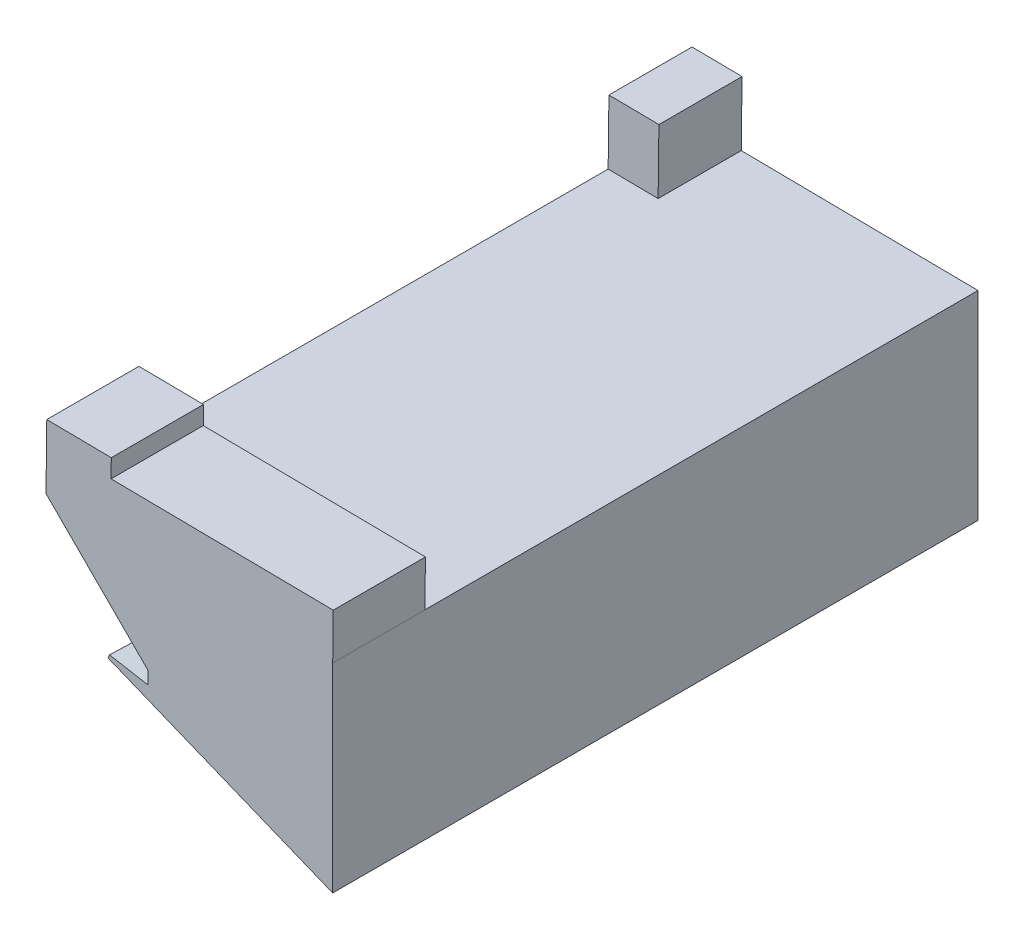
ISO-10303-21;
HEADER;
FILE_DESCRIPTION(('STEP AP214'),'2;1');
FILE_NAME('part.step','',(''),(''),'','','');
FILE_SCHEMA(('AUTOMOTIVE_DESIGN { 1 0 10303 214 1 1 1 1 }'));
ENDSEC;
DATA;
#1=APPLICATION_CONTEXT('core data for automotive mechanical design processes');
#2=APPLICATION_PROTOCOL_DEFINITION('international standard','automotive_design',2000,#1);
#3=PRODUCT_CONTEXT('',#1,'mechanical');
#4=PRODUCT('Part','Part','',(#3));
#5=PRODUCT_RELATED_PRODUCT_CATEGORY('part','',(#4));
#6=PRODUCT_DEFINITION_FORMATION('','',#4);
#7=PRODUCT_DEFINITION_CONTEXT('part definition',#1,'design');
#8=PRODUCT_DEFINITION('design','',#6,#7);
#9=PRODUCT_DEFINITION_SHAPE('','',#8);
#10=(LENGTH_UNIT() NAMED_UNIT(*) SI_UNIT(.MILLI.,.METRE.));
#11=(NAMED_UNIT(*) PLANE_ANGLE_UNIT() SI_UNIT($,.RADIAN.));
#12=(NAMED_UNIT(*) SI_UNIT($,.STERADIAN.) SOLID_ANGLE_UNIT());
#13=UNCERTAINTY_MEASURE_WITH_UNIT(LENGTH_MEASURE(1.E-05),#10,'distance_accuracy_value','');
#14=(GEOMETRIC_REPRESENTATION_CONTEXT(3) GLOBAL_UNCERTAINTY_ASSIGNED_CONTEXT((#13)) GLOBAL_UNIT_ASSIGNED_CONTEXT((#10,
#11,#12)) REPRESENTATION_CONTEXT('',''));
#15=CARTESIAN_POINT('',(0.,0.,0.));
#16=DIRECTION('',(0.,0.,1.));
#17=DIRECTION('',(1.,0.,0.));
#18=AXIS2_PLACEMENT_3D('',#15,#16,#17);
#19=CARTESIAN_POINT('',(-5.53174457392195,4.89355431893157,35.));
#20=DIRECTION('',(-0.0118275881117947,-0.999930051633342,0.));
#21=DIRECTION('',(0.999930051633342,-0.0118275881117947,0.));
#22=AXIS2_PLACEMENT_3D('',#19,#20,#21);
#23=PLANE('',#22);
#24=DIRECTION('',(0.999930051633342,-0.0118275881117946,0.));
#25=VECTOR('',#24,1.);
#26=CARTESIAN_POINT('',(-5.53174457392195,4.89355431893157,4.5099339324679));
#27=LINE('',#26,#25);
#28=CARTESIAN_POINT('',(-5.53174457392195,4.89355431893157,4.5099339324679));
#29=VERTEX_POINT('',#28);
#30=CARTESIAN_POINT('',(-2.82079087680111,4.8614880322275,4.5099339324679));
#31=VERTEX_POINT('',#30);
#32=EDGE_CURVE('E254',#29,#31,#27,.T.);
#33=ORIENTED_EDGE('',*,*,#32,.F.);
#34=DIRECTION('',(0.,0.,-1.));
#35=VECTOR('',#34,1.);
#36=CARTESIAN_POINT('',(-5.53174457392195,4.89355431893157,35.));
#37=LINE('',#36,#35);
#38=CARTESIAN_POINT('',(-5.53174457392195,4.89355431893157,30.));
#39=VERTEX_POINT('',#38);
#40=EDGE_CURVE('E175',#39,#29,#37,.T.);
#41=ORIENTED_EDGE('',*,*,#40,.F.);
#42=DIRECTION('',(-0.999930051633342,0.0118275881117947,0.));
#43=VECTOR('',#42,1.);
#44=CARTESIAN_POINT('',(10.0185837776015,4.70961857418167,30.));
#45=LINE('',#44,#43);
#46=CARTESIAN_POINT('',(10.0185837776015,4.70961857418167,30.));
#47=VERTEX_POINT('',#46);
#48=EDGE_CURVE('E215',#47,#39,#45,.T.);
#49=ORIENTED_EDGE('',*,*,#48,.F.);
#50=DIRECTION('',(0.,0.,-1.));
#51=VECTOR('',#50,1.);
#52=CARTESIAN_POINT('',(10.0185837776015,4.70961857418167,35.));
#53=LINE('',#52,#51);
#54=CARTESIAN_POINT('',(10.0185837776015,4.70961857418167,0.));
#55=VERTEX_POINT('',#54);
#56=EDGE_CURVE('E172',#47,#55,#53,.T.);
#57=ORIENTED_EDGE('',*,*,#56,.T.);
#58=DIRECTION('',(-0.999930051633342,0.0118275881117947,0.));
#59=VECTOR('',#58,1.);
#60=CARTESIAN_POINT('',(-5.53174457392195,4.89355431893157,0.));
#61=LINE('',#60,#59);
#62=CARTESIAN_POINT('',(-2.82079087680111,4.8614880322275,0.));
#63=VERTEX_POINT('',#62);
#64=EDGE_CURVE('E183',#55,#63,#61,.T.);
#65=ORIENTED_EDGE('',*,*,#64,.T.);
#66=DIRECTION('',(0.,0.,-1.));
#67=VECTOR('',#66,1.);
#68=CARTESIAN_POINT('',(-2.82079087680111,4.8614880322275,0.));
#69=LINE('',#68,#67);
#70=EDGE_CURVE('E250',#31,#63,#69,.T.);
#71=ORIENTED_EDGE('',*,*,#70,.F.);
#72=EDGE_LOOP('',(#33,#41,#49,#57,#65,#71));
#73=FACE_BOUND('',#72,.T.);
#74=ADVANCED_FACE('F33',(#73),#23,.F.);
#75=CARTESIAN_POINT('',(10.0599803359928,8.20937375489837,35.));
#76=DIRECTION('',(-0.999930051633342,0.0118275881117947,0.));
#77=DIRECTION('',(-0.0118275881117947,-0.999930051633342,0.));
#78=AXIS2_PLACEMENT_3D('',#75,#76,#77);
#79=PLANE('',#78);
#80=DIRECTION('',(0.,0.,-1.));
#81=VECTOR('',#80,1.);
#82=CARTESIAN_POINT('',(10.048152747881,7.20944370326504,35.));
#83=LINE('',#82,#81);
#84=CARTESIAN_POINT('',(10.048152747881,7.20944370326504,35.));
#85=VERTEX_POINT('',#84);
#86=CARTESIAN_POINT('',(10.048152747881,7.20944370326504,30.));
#87=VERTEX_POINT('',#86);
#88=EDGE_CURVE('E226',#85,#87,#83,.T.);
#89=ORIENTED_EDGE('',*,*,#88,.F.);
#90=DIRECTION('',(-0.0118275881117947,-0.999930051633342,0.));
#91=VECTOR('',#90,1.);
#92=CARTESIAN_POINT('',(10.0599803359928,8.20937375489837,35.));
#93=LINE('',#92,#91);
#94=CARTESIAN_POINT('',(10.0185837776015,4.70961857418167,35.));
#95=VERTEX_POINT('',#94);
#96=EDGE_CURVE('E196',#85,#95,#93,.T.);
#97=ORIENTED_EDGE('',*,*,#96,.T.);
#98=EDGE_CURVE('E169',#95,#47,#53,.T.);
#99=ORIENTED_EDGE('',*,*,#98,.T.);
#100=DIRECTION('',(-0.0118275881117947,-0.999930051633342,0.));
#101=VECTOR('',#100,1.);
#102=CARTESIAN_POINT('',(10.0599803359928,8.20937375489837,30.));
#103=LINE('',#102,#101);
#104=EDGE_CURVE('E206',#87,#47,#103,.T.);
#105=ORIENTED_EDGE('',*,*,#104,.F.);
#106=EDGE_LOOP('',(#89,#97,#99,#105));
#107=FACE_BOUND('',#106,.T.);
#108=ADVANCED_FACE('F290',(#107),#79,.F.);
#109=CARTESIAN_POINT('',(0.,-1.32681987793948,35.));
#110=DIRECTION('',(1.,0.,0.));
#111=DIRECTION('',(0.,0.,-1.));
#112=AXIS2_PLACEMENT_3D('',#109,#110,#111);
#113=PLANE('',#112);
#114=DIRECTION('',(0.,-1.,0.));
#115=VECTOR('',#114,1.);
#116=CARTESIAN_POINT('',(0.,-1.32681987793948,0.));
#117=LINE('',#116,#115);
#118=CARTESIAN_POINT('',(0.,-0.638190254990373,0.));
#119=VERTEX_POINT('',#118);
#120=CARTESIAN_POINT('',(0.,-1.32681987793948,0.));
#121=VERTEX_POINT('',#120);
#122=EDGE_CURVE('E193',#119,#121,#117,.T.);
#123=ORIENTED_EDGE('',*,*,#122,.T.);
#124=DIRECTION('',(0.,0.,-1.));
#125=VECTOR('',#124,1.);
#126=CARTESIAN_POINT('',(0.,-1.32681987793948,35.));
#127=LINE('',#126,#125);
#128=CARTESIAN_POINT('',(0.,-1.32681987793948,35.));
#129=VERTEX_POINT('',#128);
#130=EDGE_CURVE('E163',#129,#121,#127,.T.);
#131=ORIENTED_EDGE('',*,*,#130,.F.);
#132=DIRECTION('',(0.,-1.,0.));
#133=VECTOR('',#132,1.);
#134=CARTESIAN_POINT('',(0.,-1.32681987793948,35.));
#135=LINE('',#134,#133);
#136=CARTESIAN_POINT('',(0.,-0.638190254990373,35.));
#137=VERTEX_POINT('',#136);
#138=EDGE_CURVE('E182',#137,#129,#135,.T.);
#139=ORIENTED_EDGE('',*,*,#138,.F.);
#140=DIRECTION('',(0.,0.,-1.));
#141=VECTOR('',#140,1.);
#142=CARTESIAN_POINT('',(0.,-0.638190254990373,35.));
#143=LINE('',#142,#141);
#144=EDGE_CURVE('E176',#137,#119,#143,.T.);
#145=ORIENTED_EDGE('',*,*,#144,.T.);
#146=EDGE_LOOP('',(#123,#131,#139,#145));
#147=FACE_BOUND('',#146,.T.);
#148=ADVANCED_FACE('F336',(#147),#113,.F.);
#149=CARTESIAN_POINT('',(0.,-1.32681987793948,35.));
#150=DIRECTION('',(-0.173648177666924,-0.984807753012209,0.));
#151=DIRECTION('',(0.984807753012209,-0.173648177666924,0.));
#152=AXIS2_PLACEMENT_3D('',#149,#150,#151);
#153=PLANE('',#152);
#154=DIRECTION('',(-0.984807753012209,0.173648177666924,0.));
#155=VECTOR('',#154,1.);
#156=CARTESIAN_POINT('',(0.,-1.32681987793948,0.));
#157=LINE('',#156,#155);
#158=CARTESIAN_POINT('',(-1.05341301011606,-1.1410747424267,0.));
#159=VERTEX_POINT('',#158);
#160=EDGE_CURVE('E190',#121,#159,#157,.T.);
#161=ORIENTED_EDGE('',*,*,#160,.T.);
#162=DIRECTION('',(-0.0295463534896359,0.00520981930177231,0.99954983406447));
#163=VECTOR('',#162,1.);
#164=CARTESIAN_POINT('',(-2.0861216477553,-0.958980346400233,34.9364177123017));
#165=LINE('',#164,#163);
#166=CARTESIAN_POINT('',(-2.08800111857705,-0.958648944984903,35.));
#167=VERTEX_POINT('',#166);
#168=EDGE_CURVE('E269',#159,#167,#165,.T.);
#169=ORIENTED_EDGE('',*,*,#168,.T.);
#170=DIRECTION('',(-0.984807753012209,0.173648177666924,0.));
#171=VECTOR('',#170,1.);
#172=CARTESIAN_POINT('',(0.,-1.32681987793948,35.));
#173=LINE('',#172,#171);
#174=EDGE_CURVE('E154',#129,#167,#173,.T.);
#175=ORIENTED_EDGE('',*,*,#174,.F.);
#176=ORIENTED_EDGE('',*,*,#130,.T.);
#177=EDGE_LOOP('',(#161,#169,#175,#176));
#178=FACE_BOUND('',#177,.T.);
#179=ADVANCED_FACE('F339',(#178),#153,.F.);
#180=CARTESIAN_POINT('',(-3.03214208834861,-0.79217141842193,35.));
#181=DIRECTION('',(0.376339425693862,0.926481859870129,0.));
#182=DIRECTION('',(-0.926481859870129,0.376339425693862,0.));
#183=AXIS2_PLACEMENT_3D('',#180,#181,#182);
#184=PLANE('',#183);
#185=DIRECTION('',(0.,0.,-1.));
#186=VECTOR('',#185,1.);
#187=CARTESIAN_POINT('',(-2.1585103097045,-1.14704299884221,35.));
#188=LINE('',#187,#186);
#189=CARTESIAN_POINT('',(-2.1585103097045,-1.14704299884221,35.));
#190=VERTEX_POINT('',#189);
#191=CARTESIAN_POINT('',(-2.1585103097045,-1.14704299884221,34.8100512014243));
#192=VERTEX_POINT('',#191);
#193=EDGE_CURVE('E156',#190,#192,#188,.T.);
#194=ORIENTED_EDGE('',*,*,#193,.T.);
#195=DIRECTION('',(0.0271787175710836,-0.011040068246162,-0.999569624490616));
#196=VECTOR('',#195,1.);
#197=CARTESIAN_POINT('',(-2.16442247023924,-1.14464146331666,35.027486629354));
#198=LINE('',#197,#196);
#199=CARTESIAN_POINT('',(-1.21201040908917,-1.53151380657805,0.));
#200=VERTEX_POINT('',#199);
#201=EDGE_CURVE('E47',#192,#200,#198,.T.);
#202=ORIENTED_EDGE('',*,*,#201,.T.);
#203=DIRECTION('',(0.926481859870129,-0.376339425693862,0.));
#204=VECTOR('',#203,1.);
#205=CARTESIAN_POINT('',(-3.03214208834861,-0.79217141842193,0.));
#206=LINE('',#205,#204);
#207=CARTESIAN_POINT('',(10.0168816568475,-6.09271999345941,0.));
#208=VERTEX_POINT('',#207);
#209=EDGE_CURVE('E188',#200,#208,#206,.T.);
#210=ORIENTED_EDGE('',*,*,#209,.T.);
#211=DIRECTION('',(0.,0.,-1.));
#212=VECTOR('',#211,1.);
#213=CARTESIAN_POINT('',(10.0168816568475,-6.09271999345941,35.));
#214=LINE('',#213,#212);
#215=CARTESIAN_POINT('',(10.0168816568475,-6.09271999345941,35.));
#216=VERTEX_POINT('',#215);
#217=EDGE_CURVE('E166',#216,#208,#214,.T.);
#218=ORIENTED_EDGE('',*,*,#217,.F.);
#219=DIRECTION('',(0.926481859870129,-0.376339425693862,0.));
#220=VECTOR('',#219,1.);
#221=CARTESIAN_POINT('',(-3.03214208834861,-0.79217141842193,35.));
#222=LINE('',#221,#220);
#223=EDGE_CURVE('E201',#190,#216,#222,.T.);
#224=ORIENTED_EDGE('',*,*,#223,.F.);
#225=EDGE_LOOP('',(#194,#202,#210,#218,#224));
#226=FACE_BOUND('',#225,.T.);
#227=ADVANCED_FACE('F273',(#226),#184,.F.);
#228=CARTESIAN_POINT('',(10.0185837776015,4.70961857418167,35.));
#229=DIRECTION('',(-0.999999987585902,0.000157569652363312,0.));
#230=DIRECTION('',(-0.000157569652363312,-0.999999987585902,0.));
#231=AXIS2_PLACEMENT_3D('',#228,#229,#230);
#232=PLANE('',#231);
#233=DIRECTION('',(0.000157569652363312,0.999999987585902,0.));
#234=VECTOR('',#233,1.);
#235=CARTESIAN_POINT('',(10.0185837776015,4.70961857418167,0.));
#236=LINE('',#235,#234);
#237=EDGE_CURVE('E185',#208,#55,#236,.T.);
#238=ORIENTED_EDGE('',*,*,#237,.T.);
#239=ORIENTED_EDGE('',*,*,#56,.F.);
#240=ORIENTED_EDGE('',*,*,#98,.F.);
#241=DIRECTION('',(0.000157569652363312,0.999999987585902,0.));
#242=VECTOR('',#241,1.);
#243=CARTESIAN_POINT('',(10.0185837776015,4.70961857418167,35.));
#244=LINE('',#243,#242);
#245=EDGE_CURVE('E198',#216,#95,#244,.T.);
#246=ORIENTED_EDGE('',*,*,#245,.F.);
#247=ORIENTED_EDGE('',*,*,#217,.T.);
#248=EDGE_LOOP('',(#238,#239,#240,#246,#247));
#249=FACE_BOUND('',#248,.T.);
#250=ADVANCED_FACE('F282',(#249),#232,.F.);
#251=CARTESIAN_POINT('',(0.,-0.638190254990373,35.));
#252=DIRECTION('',(0.707106781186547,0.707106781186548,0.));
#253=DIRECTION('',(-0.707106781186548,0.707106781186547,0.));
#254=AXIS2_PLACEMENT_3D('',#251,#252,#253);
#255=PLANE('',#254);
#256=DIRECTION('',(0.707106781186548,-0.707106781186547,0.));
#257=VECTOR('',#256,1.);
#258=CARTESIAN_POINT('',(0.,-0.638190254990373,0.));
#259=LINE('',#258,#257);
#260=CARTESIAN_POINT('',(-5.53174457392195,4.89355431893157,0.));
#261=VERTEX_POINT('',#260);
#262=EDGE_CURVE('E180',#261,#119,#259,.T.);
#263=ORIENTED_EDGE('',*,*,#262,.T.);
#264=ORIENTED_EDGE('',*,*,#144,.F.);
#265=DIRECTION('',(0.707106781186548,-0.707106781186547,0.));
#266=VECTOR('',#265,1.);
#267=CARTESIAN_POINT('',(0.,-0.638190254990373,35.));
#268=LINE('',#267,#266);
#269=CARTESIAN_POINT('',(-5.53174457392195,4.89355431893157,35.));
#270=VERTEX_POINT('',#269);
#271=EDGE_CURVE('E179',#270,#137,#268,.T.);
#272=ORIENTED_EDGE('',*,*,#271,.F.);
#273=EDGE_CURVE('E173',#270,#39,#37,.T.);
#274=ORIENTED_EDGE('',*,*,#273,.T.);
#275=ORIENTED_EDGE('',*,*,#40,.T.);
#276=DIRECTION('',(0.,0.,1.));
#277=VECTOR('',#276,1.);
#278=CARTESIAN_POINT('',(-5.53174457392195,4.89355431893157,0.));
#279=LINE('',#278,#277);
#280=EDGE_CURVE('E257',#261,#29,#279,.T.);
#281=ORIENTED_EDGE('',*,*,#280,.F.);
#282=EDGE_LOOP('',(#263,#264,#272,#274,#275,#281));
#283=FACE_BOUND('',#282,.T.);
#284=ADVANCED_FACE('F315',(#283),#255,.F.);
#285=CARTESIAN_POINT('',(0.,0.,35.));
#286=DIRECTION('',(0.,0.,-1.));
#287=DIRECTION('',(-1.,0.,0.));
#288=AXIS2_PLACEMENT_3D('',#285,#286,#287);
#289=PLANE('',#288);
#290=ORIENTED_EDGE('',*,*,#174,.T.);
#291=DIRECTION('',(-0.376339425693862,-0.926481859870129,0.));
#292=VECTOR('',#291,1.);
#293=CARTESIAN_POINT('',(-1.45802096308096,0.59225204039334,35.));
#294=LINE('',#293,#292);
#295=CARTESIAN_POINT('',(-2.16361657532659,-1.14480097748875,35.));
#296=VERTEX_POINT('',#295);
#297=EDGE_CURVE('E146',#167,#296,#294,.T.);
#298=ORIENTED_EDGE('',*,*,#297,.T.);
#299=CARTESIAN_POINT('',(-2.12087636713511,-1.0543948128552,35.));
#300=DIRECTION('',(0.,0.,-1.));
#301=DIRECTION('',(-1.,0.,0.));
#302=AXIS2_PLACEMENT_3D('',#299,#300,#301);
#303=CIRCLE('',#302,0.1);
#304=EDGE_CURVE('E41',#296,#190,#303,.F.);
#305=ORIENTED_EDGE('',*,*,#304,.T.);
#306=ORIENTED_EDGE('',*,*,#223,.T.);
#307=ORIENTED_EDGE('',*,*,#245,.T.);
#308=ORIENTED_EDGE('',*,*,#96,.F.);
#309=DIRECTION('',(0.999930051633342,-0.0118275881117949,0.));
#310=VECTOR('',#309,1.);
#311=CARTESIAN_POINT('',(0.0866700206989904,7.32727225985999,35.));
#312=LINE('',#311,#310);
#313=CARTESIAN_POINT('',(-2.00242042292577,7.35198288962365,35.));
#314=VERTEX_POINT('',#313);
#315=EDGE_CURVE('E219',#314,#85,#312,.T.);
#316=ORIENTED_EDGE('',*,*,#315,.F.);
#317=DIRECTION('',(0.0118275881117947,0.999930051633342,0.));
#318=VECTOR('',#317,1.);
#319=CARTESIAN_POINT('',(-2.08909044362476,0.0247106297636712,35.));
#320=LINE('',#319,#318);
#321=CARTESIAN_POINT('',(-1.99059283481397,8.35191294125699,35.));
#322=VERTEX_POINT('',#321);
#323=EDGE_CURVE('E228',#314,#322,#320,.T.);
#324=ORIENTED_EDGE('',*,*,#323,.T.);
#325=DIRECTION('',(0.999930051633342,-0.0118275881117947,0.));
#326=VECTOR('',#325,1.);
#327=CARTESIAN_POINT('',(-5.49034801553067,8.39330949964827,35.));
#328=LINE('',#327,#326);
#329=CARTESIAN_POINT('',(-5.49034801553067,8.39330949964827,35.));
#330=VERTEX_POINT('',#329);
#331=EDGE_CURVE('E218',#330,#322,#328,.T.);
#332=ORIENTED_EDGE('',*,*,#331,.F.);
#333=DIRECTION('',(-0.0118275881117947,-0.999930051633342,0.));
#334=VECTOR('',#333,1.);
#335=CARTESIAN_POINT('',(-5.49034801553067,8.39330949964827,35.));
#336=LINE('',#335,#334);
#337=EDGE_CURVE('E211',#330,#270,#336,.T.);
#338=ORIENTED_EDGE('',*,*,#337,.T.);
#339=ORIENTED_EDGE('',*,*,#271,.T.);
#340=ORIENTED_EDGE('',*,*,#138,.T.);
#341=EDGE_LOOP('',(#290,#298,#305,#306,#307,#308,#316,#324,#332,#338,#339,#340));
#342=FACE_BOUND('',#341,.T.);
#343=ADVANCED_FACE('F152',(#342),#289,.F.);
#344=CARTESIAN_POINT('',(0.,0.,0.));
#345=DIRECTION('',(0.,0.,-1.));
#346=DIRECTION('',(-1.,0.,0.));
#347=AXIS2_PLACEMENT_3D('',#344,#345,#346);
#348=PLANE('',#347);
#349=DIRECTION('',(-0.376339425693862,-0.926481859870129,0.));
#350=VECTOR('',#349,1.);
#351=CARTESIAN_POINT('',(-0.506356274918103,0.205683282051388,0.));
#352=LINE('',#351,#350);
#353=EDGE_CURVE('E260',#159,#200,#352,.T.);
#354=ORIENTED_EDGE('',*,*,#353,.F.);
#355=ORIENTED_EDGE('',*,*,#160,.F.);
#356=ORIENTED_EDGE('',*,*,#122,.F.);
#357=ORIENTED_EDGE('',*,*,#262,.F.);
#358=DIRECTION('',(-0.0118275881117947,-0.999930051633342,0.));
#359=VECTOR('',#358,1.);
#360=CARTESIAN_POINT('',(-5.49034801553067,8.39330949964827,0.));
#361=LINE('',#360,#359);
#362=CARTESIAN_POINT('',(-5.49034801553067,8.39330949964827,0.));
#363=VERTEX_POINT('',#362);
#364=EDGE_CURVE('E246',#363,#261,#361,.T.);
#365=ORIENTED_EDGE('',*,*,#364,.F.);
#366=DIRECTION('',(-0.999930051633342,0.0118275881117946,0.));
#367=VECTOR('',#366,1.);
#368=CARTESIAN_POINT('',(-5.49034801553067,8.39330949964827,0.));
#369=LINE('',#368,#367);
#370=CARTESIAN_POINT('',(-2.77939431840983,8.3612432129442,0.));
#371=VERTEX_POINT('',#370);
#372=EDGE_CURVE('E249',#371,#363,#369,.T.);
#373=ORIENTED_EDGE('',*,*,#372,.F.);
#374=DIRECTION('',(-0.0118275881117947,-0.999930051633342,0.));
#375=VECTOR('',#374,1.);
#376=CARTESIAN_POINT('',(-2.77939431840983,8.3612432129442,0.));
#377=LINE('',#376,#375);
#378=EDGE_CURVE('E243',#371,#63,#377,.T.);
#379=ORIENTED_EDGE('',*,*,#378,.T.);
#380=ORIENTED_EDGE('',*,*,#64,.F.);
#381=ORIENTED_EDGE('',*,*,#237,.F.);
#382=ORIENTED_EDGE('',*,*,#209,.F.);
#383=EDGE_LOOP('',(#354,#355,#356,#357,#365,#373,#379,#380,#381,#382));
#384=FACE_BOUND('',#383,.T.);
#385=ADVANCED_FACE('F278',(#384),#348,.T.);
#386=CARTESIAN_POINT('',(10.0599803359928,8.20937375489837,30.));
#387=DIRECTION('',(0.,0.,1.));
#388=DIRECTION('',(1.,0.,0.));
#389=AXIS2_PLACEMENT_3D('',#386,#387,#388);
#390=PLANE('',#389);
#391=DIRECTION('',(-0.999930051633342,0.0118275881117947,0.));
#392=VECTOR('',#391,1.);
#393=CARTESIAN_POINT('',(10.0599803359928,8.20937375489837,30.));
#394=LINE('',#393,#392);
#395=CARTESIAN_POINT('',(-1.99059283481397,8.35191294125699,30.));
#396=VERTEX_POINT('',#395);
#397=CARTESIAN_POINT('',(-5.49034801553067,8.39330949964827,30.));
#398=VERTEX_POINT('',#397);
#399=EDGE_CURVE('E221',#396,#398,#394,.T.);
#400=ORIENTED_EDGE('',*,*,#399,.F.);
#401=DIRECTION('',(-0.0118275881117947,-0.999930051633342,0.));
#402=VECTOR('',#401,1.);
#403=CARTESIAN_POINT('',(-1.99059283481397,8.35191294125699,30.));
#404=LINE('',#403,#402);
#405=CARTESIAN_POINT('',(-2.00242042292577,7.35198288962365,30.));
#406=VERTEX_POINT('',#405);
#407=EDGE_CURVE('E231',#396,#406,#404,.T.);
#408=ORIENTED_EDGE('',*,*,#407,.T.);
#409=DIRECTION('',(-0.999930051633342,0.0118275881117949,0.));
#410=VECTOR('',#409,1.);
#411=CARTESIAN_POINT('',(10.048152747881,7.20944370326504,30.));
#412=LINE('',#411,#410);
#413=EDGE_CURVE('E157',#87,#406,#412,.T.);
#414=ORIENTED_EDGE('',*,*,#413,.F.);
#415=ORIENTED_EDGE('',*,*,#104,.T.);
#416=ORIENTED_EDGE('',*,*,#48,.T.);
#417=DIRECTION('',(-0.0118275881117947,-0.999930051633342,0.));
#418=VECTOR('',#417,1.);
#419=CARTESIAN_POINT('',(-5.49034801553067,8.39330949964827,30.));
#420=LINE('',#419,#418);
#421=EDGE_CURVE('E208',#398,#39,#420,.T.);
#422=ORIENTED_EDGE('',*,*,#421,.F.);
#423=EDGE_LOOP('',(#400,#408,#414,#415,#416,#422));
#424=FACE_BOUND('',#423,.T.);
#425=ADVANCED_FACE('F297',(#424),#390,.F.);
#426=CARTESIAN_POINT('',(-5.49034801553067,8.39330949964827,30.));
#427=DIRECTION('',(0.999930051633342,-0.0118275881117947,0.));
#428=DIRECTION('',(0.0118275881117947,0.999930051633342,0.));
#429=AXIS2_PLACEMENT_3D('',#426,#427,#428);
#430=PLANE('',#429);
#431=ORIENTED_EDGE('',*,*,#273,.F.);
#432=ORIENTED_EDGE('',*,*,#337,.F.);
#433=DIRECTION('',(0.,0.,1.));
#434=VECTOR('',#433,1.);
#435=CARTESIAN_POINT('',(-5.49034801553067,8.39330949964827,30.));
#436=LINE('',#435,#434);
#437=EDGE_CURVE('E214',#398,#330,#436,.T.);
#438=ORIENTED_EDGE('',*,*,#437,.F.);
#439=ORIENTED_EDGE('',*,*,#421,.T.);
#440=EDGE_LOOP('',(#431,#432,#438,#439));
#441=FACE_BOUND('',#440,.T.);
#442=ADVANCED_FACE('F311',(#441),#430,.F.);
#443=CARTESIAN_POINT('',(0.098497608810784,8.32720231149332,0.));
#444=DIRECTION('',(0.0118275881117947,0.999930051633342,0.));
#445=DIRECTION('',(-0.999930051633342,0.0118275881117947,0.));
#446=AXIS2_PLACEMENT_3D('',#443,#444,#445);
#447=PLANE('',#446);
#448=DIRECTION('',(0.,0.,1.));
#449=VECTOR('',#448,1.);
#450=CARTESIAN_POINT('',(-1.99059283481398,8.35191294125699,0.));
#451=LINE('',#450,#449);
#452=EDGE_CURVE('E161',#396,#322,#451,.T.);
#453=ORIENTED_EDGE('',*,*,#452,.F.);
#454=ORIENTED_EDGE('',*,*,#399,.T.);
#455=ORIENTED_EDGE('',*,*,#437,.T.);
#456=ORIENTED_EDGE('',*,*,#331,.T.);
#457=EDGE_LOOP('',(#453,#454,#455,#456));
#458=FACE_BOUND('',#457,.T.);
#459=ADVANCED_FACE('F304',(#458),#447,.T.);
#460=CARTESIAN_POINT('',(0.086670020698992,7.32727225985998,0.));
#461=DIRECTION('',(0.0118275881117949,0.999930051633342,0.));
#462=DIRECTION('',(-0.999930051633342,0.0118275881117949,0.));
#463=AXIS2_PLACEMENT_3D('',#460,#461,#462);
#464=PLANE('',#463);
#465=ORIENTED_EDGE('',*,*,#315,.T.);
#466=ORIENTED_EDGE('',*,*,#88,.T.);
#467=ORIENTED_EDGE('',*,*,#413,.T.);
#468=DIRECTION('',(0.,0.,1.));
#469=VECTOR('',#468,1.);
#470=CARTESIAN_POINT('',(-2.00242042292577,7.35198288962365,28.5940817695337));
#471=LINE('',#470,#469);
#472=EDGE_CURVE('E234',#406,#314,#471,.T.);
#473=ORIENTED_EDGE('',*,*,#472,.T.);
#474=EDGE_LOOP('',(#465,#466,#467,#473));
#475=FACE_BOUND('',#474,.T.);
#476=ADVANCED_FACE('F293',(#475),#464,.T.);
#477=CARTESIAN_POINT('',(-2.00242042292577,7.35198288962365,28.5940817695337));
#478=DIRECTION('',(-0.999930051633342,0.0118275881117947,0.));
#479=DIRECTION('',(-0.0118275881117947,-0.999930051633342,0.));
#480=AXIS2_PLACEMENT_3D('',#477,#478,#479);
#481=PLANE('',#480);
#482=ORIENTED_EDGE('',*,*,#472,.F.);
#483=ORIENTED_EDGE('',*,*,#407,.F.);
#484=ORIENTED_EDGE('',*,*,#452,.T.);
#485=ORIENTED_EDGE('',*,*,#323,.F.);
#486=EDGE_LOOP('',(#482,#483,#484,#485));
#487=FACE_BOUND('',#486,.T.);
#488=ADVANCED_FACE('F302',(#487),#481,.F.);
#489=CARTESIAN_POINT('',(-5.49034801553067,8.39330949964827,0.));
#490=DIRECTION('',(0.999930051633342,-0.0118275881117947,0.));
#491=DIRECTION('',(0.0118275881117947,0.999930051633342,0.));
#492=AXIS2_PLACEMENT_3D('',#489,#490,#491);
#493=PLANE('',#492);
#494=ORIENTED_EDGE('',*,*,#280,.T.);
#495=DIRECTION('',(-0.0118275881117947,-0.999930051633342,0.));
#496=VECTOR('',#495,1.);
#497=CARTESIAN_POINT('',(-5.49034801553067,8.39330949964827,4.5099339324679));
#498=LINE('',#497,#496);
#499=CARTESIAN_POINT('',(-5.49034801553067,8.39330949964827,4.5099339324679));
#500=VERTEX_POINT('',#499);
#501=EDGE_CURVE('E237',#500,#29,#498,.T.);
#502=ORIENTED_EDGE('',*,*,#501,.F.);
#503=DIRECTION('',(0.,0.,1.));
#504=VECTOR('',#503,1.);
#505=CARTESIAN_POINT('',(-5.49034801553067,8.39330949964827,0.));
#506=LINE('',#505,#504);
#507=EDGE_CURVE('E253',#363,#500,#506,.T.);
#508=ORIENTED_EDGE('',*,*,#507,.F.);
#509=ORIENTED_EDGE('',*,*,#364,.T.);
#510=EDGE_LOOP('',(#494,#502,#508,#509));
#511=FACE_BOUND('',#510,.T.);
#512=ADVANCED_FACE('F332',(#511),#493,.F.);
#513=CARTESIAN_POINT('',(-5.49034801553067,8.39330949964827,4.5099339324679));
#514=DIRECTION('',(0.,0.,-1.));
#515=DIRECTION('',(-1.,0.,0.));
#516=AXIS2_PLACEMENT_3D('',#513,#514,#515);
#517=PLANE('',#516);
#518=ORIENTED_EDGE('',*,*,#32,.T.);
#519=DIRECTION('',(-0.0118275881117947,-0.999930051633342,0.));
#520=VECTOR('',#519,1.);
#521=CARTESIAN_POINT('',(-2.77939431840983,8.3612432129442,4.5099339324679));
#522=LINE('',#521,#520);
#523=CARTESIAN_POINT('',(-2.77939431840983,8.3612432129442,4.5099339324679));
#524=VERTEX_POINT('',#523);
#525=EDGE_CURVE('E240',#524,#31,#522,.T.);
#526=ORIENTED_EDGE('',*,*,#525,.F.);
#527=DIRECTION('',(0.999930051633342,-0.0118275881117946,0.));
#528=VECTOR('',#527,1.);
#529=CARTESIAN_POINT('',(-5.49034801553067,8.39330949964827,4.5099339324679));
#530=LINE('',#529,#528);
#531=EDGE_CURVE('E264',#500,#524,#530,.T.);
#532=ORIENTED_EDGE('',*,*,#531,.F.);
#533=ORIENTED_EDGE('',*,*,#501,.T.);
#534=EDGE_LOOP('',(#518,#526,#532,#533));
#535=FACE_BOUND('',#534,.T.);
#536=ADVANCED_FACE('F320',(#535),#517,.F.);
#537=CARTESIAN_POINT('',(-2.77939431840983,8.3612432129442,0.));
#538=DIRECTION('',(-0.999930051633342,0.0118275881117947,0.));
#539=DIRECTION('',(-0.0118275881117947,-0.999930051633342,0.));
#540=AXIS2_PLACEMENT_3D('',#537,#538,#539);
#541=PLANE('',#540);
#542=ORIENTED_EDGE('',*,*,#70,.T.);
#543=ORIENTED_EDGE('',*,*,#378,.F.);
#544=DIRECTION('',(0.,0.,-1.));
#545=VECTOR('',#544,1.);
#546=CARTESIAN_POINT('',(-2.77939431840983,8.3612432129442,0.));
#547=LINE('',#546,#545);
#548=EDGE_CURVE('E262',#524,#371,#547,.T.);
#549=ORIENTED_EDGE('',*,*,#548,.F.);
#550=ORIENTED_EDGE('',*,*,#525,.T.);
#551=EDGE_LOOP('',(#542,#543,#549,#550));
#552=FACE_BOUND('',#551,.T.);
#553=ADVANCED_FACE('F324',(#552),#541,.F.);
#554=CARTESIAN_POINT('',(0.0984976088107833,8.32720231149332,0.));
#555=DIRECTION('',(0.0118275881117946,0.999930051633342,0.));
#556=DIRECTION('',(-0.999930051633342,0.0118275881117946,0.));
#557=AXIS2_PLACEMENT_3D('',#554,#555,#556);
#558=PLANE('',#557);
#559=ORIENTED_EDGE('',*,*,#507,.T.);
#560=ORIENTED_EDGE('',*,*,#531,.T.);
#561=ORIENTED_EDGE('',*,*,#548,.T.);
#562=ORIENTED_EDGE('',*,*,#372,.T.);
#563=EDGE_LOOP('',(#559,#560,#561,#562));
#564=FACE_BOUND('',#563,.T.);
#565=ADVANCED_FACE('F328',(#564),#558,.T.);
#566=CARTESIAN_POINT('',(-2.12087636713511,-1.0543948128552,35.));
#567=DIRECTION('',(0.,0.,-1.));
#568=DIRECTION('',(-1.,0.,0.));
#569=AXIS2_PLACEMENT_3D('',#566,#567,#568);
#570=CYLINDRICAL_SURFACE('',#569,0.1);
#571=CARTESIAN_POINT('',(-2.12087636713511,-1.0543948128552,34.8100512014243));
#572=DIRECTION('',(0.926083124767753,-0.376177458421828,0.0293354017475241));
#573=DIRECTION('',(0.0271787175710836,-0.011040068246162,-0.999569624490616));
#574=AXIS2_PLACEMENT_3D('',#571,#572,#573);
#575=ELLIPSE('',#574,3.4088505369946,0.1);
#576=EDGE_CURVE('E11',#192,#296,#575,.F.);
#577=ORIENTED_EDGE('',*,*,#576,.F.);
#578=ORIENTED_EDGE('',*,*,#193,.F.);
#579=ORIENTED_EDGE('',*,*,#304,.F.);
#580=EDGE_LOOP('',(#577,#578,#579));
#581=FACE_BOUND('',#580,.T.);
#582=ADVANCED_FACE('F35',(#581),#570,.T.);
#583=CARTESIAN_POINT('',(-1.88145102801259,-0.180233277202894,38.4613425473042));
#584=DIRECTION('',(0.926083124767753,-0.376177458421828,0.0293354017475241));
#585=DIRECTION('',(0.376339425693862,0.926481859870129,0.));
#586=AXIS2_PLACEMENT_3D('',#583,#584,#585);
#587=PLANE('',#586);
#588=ORIENTED_EDGE('',*,*,#353,.T.);
#589=ORIENTED_EDGE('',*,*,#201,.F.);
#590=ORIENTED_EDGE('',*,*,#576,.T.);
#591=ORIENTED_EDGE('',*,*,#297,.F.);
#592=ORIENTED_EDGE('',*,*,#168,.F.);
#593=EDGE_LOOP('',(#588,#589,#590,#591,#592));
#594=FACE_BOUND('',#593,.T.);
#595=ADVANCED_FACE('F145',(#594),#587,.F.);
#596=CLOSED_SHELL('',(#74,#108,#148,#179,#227,#250,#284,#343,#385,#425,#442,#459,#476,#488,#512,
#536,#553,#565,#582,#595));
#597=MANIFOLD_SOLID_BREP('B2',#596);
#598=ADVANCED_BREP_SHAPE_REPRESENTATION('',(#18,#597),#14);
#599=SHAPE_DEFINITION_REPRESENTATION(#9,#598);
ENDSEC;
END-ISO-10303-21;
